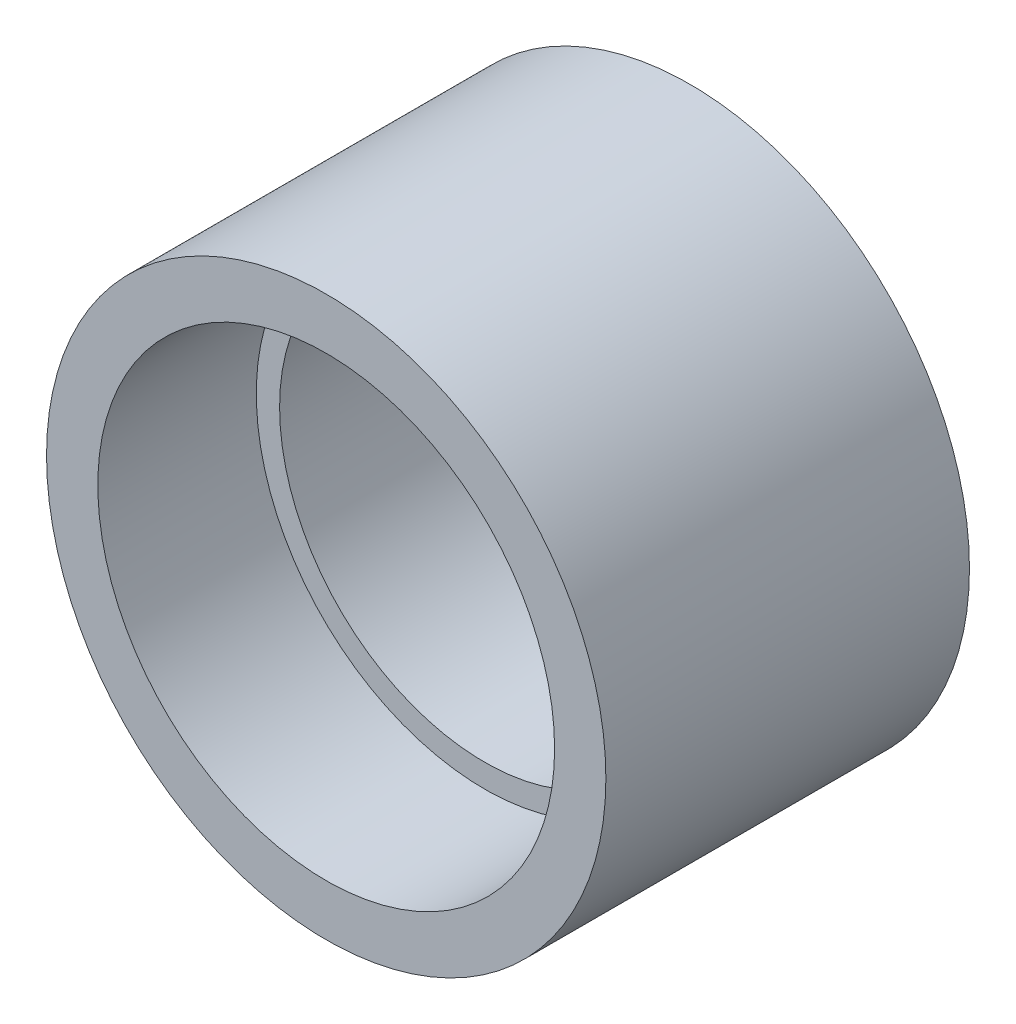
ISO-10303-21;
HEADER;
FILE_DESCRIPTION(('STEP AP214'),'2;1');
FILE_NAME('part.step','',(''),(''),'','','');
FILE_SCHEMA(('AUTOMOTIVE_DESIGN { 1 0 10303 214 1 1 1 1 }'));
ENDSEC;
DATA;
#1=APPLICATION_CONTEXT('core data for automotive mechanical design processes');
#2=APPLICATION_PROTOCOL_DEFINITION('international standard','automotive_design',2000,#1);
#3=PRODUCT_CONTEXT('',#1,'mechanical');
#4=PRODUCT('Part','Part','',(#3));
#5=PRODUCT_RELATED_PRODUCT_CATEGORY('part','',(#4));
#6=PRODUCT_DEFINITION_FORMATION('','',#4);
#7=PRODUCT_DEFINITION_CONTEXT('part definition',#1,'design');
#8=PRODUCT_DEFINITION('design','',#6,#7);
#9=PRODUCT_DEFINITION_SHAPE('','',#8);
#10=(LENGTH_UNIT() NAMED_UNIT(*) SI_UNIT(.MILLI.,.METRE.));
#11=(NAMED_UNIT(*) PLANE_ANGLE_UNIT() SI_UNIT($,.RADIAN.));
#12=(NAMED_UNIT(*) SI_UNIT($,.STERADIAN.) SOLID_ANGLE_UNIT());
#13=UNCERTAINTY_MEASURE_WITH_UNIT(LENGTH_MEASURE(1.E-05),#10,'distance_accuracy_value','');
#14=(GEOMETRIC_REPRESENTATION_CONTEXT(3) GLOBAL_UNCERTAINTY_ASSIGNED_CONTEXT((#13)) GLOBAL_UNIT_ASSIGNED_CONTEXT((#10,
#11,#12)) REPRESENTATION_CONTEXT('',''));
#15=CARTESIAN_POINT('',(0.,0.,0.));
#16=DIRECTION('',(0.,0.,1.));
#17=DIRECTION('',(1.,0.,0.));
#18=AXIS2_PLACEMENT_3D('',#15,#16,#17);
#19=CARTESIAN_POINT('',(0.,0.,10.));
#20=DIRECTION('',(0.,0.,1.));
#21=DIRECTION('',(1.,0.,0.));
#22=AXIS2_PLACEMENT_3D('',#19,#20,#21);
#23=PLANE('',#22);
#24=CARTESIAN_POINT('',(0.,0.,10.));
#25=DIRECTION('',(0.,0.,1.));
#26=DIRECTION('',(1.,0.,0.));
#27=AXIS2_PLACEMENT_3D('',#24,#25,#26);
#28=CIRCLE('',#27,11.);
#29=CARTESIAN_POINT('',(11.,0.,10.));
#30=VERTEX_POINT('',#29);
#31=EDGE_CURVE('E11',#30,#30,#28,.T.);
#32=ORIENTED_EDGE('',*,*,#31,.F.);
#33=EDGE_LOOP('',(#32));
#34=FACE_BOUND('',#33,.T.);
#35=CARTESIAN_POINT('',(0.,0.,10.));
#36=DIRECTION('',(0.,0.,1.));
#37=DIRECTION('',(1.,0.,0.));
#38=AXIS2_PLACEMENT_3D('',#35,#36,#37);
#39=CIRCLE('',#38,12.25);
#40=CARTESIAN_POINT('',(12.25,0.,10.));
#41=VERTEX_POINT('',#40);
#42=EDGE_CURVE('E72',#41,#41,#39,.T.);
#43=ORIENTED_EDGE('',*,*,#42,.T.);
#44=EDGE_LOOP('',(#43));
#45=FACE_BOUND('',#44,.T.);
#46=ADVANCED_FACE('F49',(#34,#45),#23,.T.);
#47=CARTESIAN_POINT('',(0.,0.,10.));
#48=DIRECTION('',(0.,0.,-1.));
#49=DIRECTION('',(-1.,0.,0.));
#50=AXIS2_PLACEMENT_3D('',#47,#48,#49);
#51=CYLINDRICAL_SURFACE('',#50,11.);
#52=ORIENTED_EDGE('',*,*,#31,.T.);
#53=EDGE_LOOP('',(#52));
#54=FACE_BOUND('',#53,.T.);
#55=CARTESIAN_POINT('',(0.,0.,0.999999999999999));
#56=DIRECTION('',(0.,0.,-1.));
#57=DIRECTION('',(-1.,0.,0.));
#58=AXIS2_PLACEMENT_3D('',#55,#56,#57);
#59=CIRCLE('',#58,11.);
#60=CARTESIAN_POINT('',(-11.,0.,0.999999999999999));
#61=VERTEX_POINT('',#60);
#62=EDGE_CURVE('E53',#61,#61,#59,.T.);
#63=ORIENTED_EDGE('',*,*,#62,.T.);
#64=EDGE_LOOP('',(#63));
#65=FACE_BOUND('',#64,.T.);
#66=ADVANCED_FACE('F95',(#54,#65),#51,.F.);
#67=CARTESIAN_POINT('',(0.,0.,1.));
#68=DIRECTION('',(0.,0.,-1.));
#69=DIRECTION('',(-1.,0.,0.));
#70=AXIS2_PLACEMENT_3D('',#67,#68,#69);
#71=PLANE('',#70);
#72=ORIENTED_EDGE('',*,*,#62,.F.);
#73=EDGE_LOOP('',(#72));
#74=FACE_BOUND('',#73,.T.);
#75=ADVANCED_FACE('F85',(#74),#71,.F.);
#76=CARTESIAN_POINT('',(0.,0.,18.5));
#77=DIRECTION('',(0.,0.,1.));
#78=DIRECTION('',(1.,0.,0.));
#79=AXIS2_PLACEMENT_3D('',#76,#77,#78);
#80=PLANE('',#79);
#81=CARTESIAN_POINT('',(0.,0.,18.5));
#82=DIRECTION('',(0.,0.,1.));
#83=DIRECTION('',(1.,0.,0.));
#84=AXIS2_PLACEMENT_3D('',#81,#82,#83);
#85=CIRCLE('',#84,15.);
#86=CARTESIAN_POINT('',(15.,0.,18.5));
#87=VERTEX_POINT('',#86);
#88=EDGE_CURVE('E67',#87,#87,#85,.T.);
#89=ORIENTED_EDGE('',*,*,#88,.T.);
#90=EDGE_LOOP('',(#89));
#91=FACE_BOUND('',#90,.T.);
#92=CARTESIAN_POINT('',(0.,0.,18.5));
#93=DIRECTION('',(0.,0.,1.));
#94=DIRECTION('',(1.,0.,0.));
#95=AXIS2_PLACEMENT_3D('',#92,#93,#94);
#96=CIRCLE('',#95,12.25);
#97=CARTESIAN_POINT('',(12.25,0.,18.5));
#98=VERTEX_POINT('',#97);
#99=EDGE_CURVE('E71',#98,#98,#96,.T.);
#100=ORIENTED_EDGE('',*,*,#99,.F.);
#101=EDGE_LOOP('',(#100));
#102=FACE_BOUND('',#101,.T.);
#103=ADVANCED_FACE('F83',(#91,#102),#80,.T.);
#104=CARTESIAN_POINT('',(0.,0.,18.5));
#105=DIRECTION('',(0.,0.,-1.));
#106=DIRECTION('',(-1.,0.,0.));
#107=AXIS2_PLACEMENT_3D('',#104,#105,#106);
#108=CYLINDRICAL_SURFACE('',#107,12.25);
#109=ORIENTED_EDGE('',*,*,#99,.T.);
#110=EDGE_LOOP('',(#109));
#111=FACE_BOUND('',#110,.T.);
#112=ORIENTED_EDGE('',*,*,#42,.F.);
#113=EDGE_LOOP('',(#112));
#114=FACE_BOUND('',#113,.T.);
#115=ADVANCED_FACE('F80',(#111,#114),#108,.F.);
#116=CARTESIAN_POINT('',(0.,0.,-1.));
#117=DIRECTION('',(0.,0.,-1.));
#118=DIRECTION('',(-1.,0.,0.));
#119=AXIS2_PLACEMENT_3D('',#116,#117,#118);
#120=PLANE('',#119);
#121=CARTESIAN_POINT('',(0.,0.,-1.));
#122=DIRECTION('',(0.,0.,-1.));
#123=DIRECTION('',(-1.,0.,0.));
#124=AXIS2_PLACEMENT_3D('',#121,#122,#123);
#125=CIRCLE('',#124,15.);
#126=CARTESIAN_POINT('',(-15.,0.,-1.));
#127=VERTEX_POINT('',#126);
#128=EDGE_CURVE('E62',#127,#127,#125,.T.);
#129=ORIENTED_EDGE('',*,*,#128,.T.);
#130=EDGE_LOOP('',(#129));
#131=FACE_BOUND('',#130,.T.);
#132=ADVANCED_FACE('F92',(#131),#120,.T.);
#133=CARTESIAN_POINT('',(0.,0.,10.));
#134=DIRECTION('',(0.,0.,-1.));
#135=DIRECTION('',(-1.,0.,0.));
#136=AXIS2_PLACEMENT_3D('',#133,#134,#135);
#137=CYLINDRICAL_SURFACE('',#136,15.);
#138=ORIENTED_EDGE('',*,*,#128,.F.);
#139=EDGE_LOOP('',(#138));
#140=FACE_BOUND('',#139,.T.);
#141=ORIENTED_EDGE('',*,*,#88,.F.);
#142=EDGE_LOOP('',(#141));
#143=FACE_BOUND('',#142,.T.);
#144=ADVANCED_FACE('F51',(#140,#143),#137,.T.);
#145=CLOSED_SHELL('',(#46,#66,#75,#103,#115,#132,#144));
#146=MANIFOLD_SOLID_BREP('B2',#145);
#147=ADVANCED_BREP_SHAPE_REPRESENTATION('',(#18,#146),#14);
#148=SHAPE_DEFINITION_REPRESENTATION(#9,#147);
ENDSEC;
END-ISO-10303-21;
